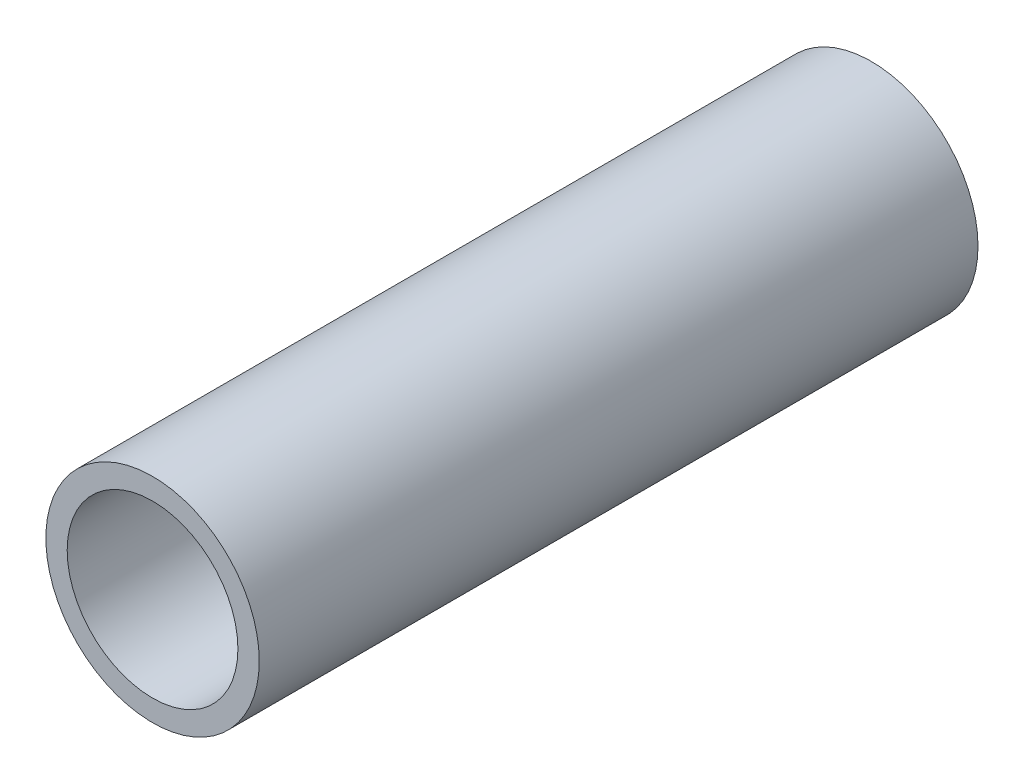
ISO-10303-21;
HEADER;
FILE_DESCRIPTION(('STEP AP214'),'2;1');
FILE_NAME('part.step','',(''),(''),'','','');
FILE_SCHEMA(('AUTOMOTIVE_DESIGN { 1 0 10303 214 1 1 1 1 }'));
ENDSEC;
DATA;
#1=APPLICATION_CONTEXT('core data for automotive mechanical design processes');
#2=APPLICATION_PROTOCOL_DEFINITION('international standard','automotive_design',2000,#1);
#3=PRODUCT_CONTEXT('',#1,'mechanical');
#4=PRODUCT('Part','Part','',(#3));
#5=PRODUCT_RELATED_PRODUCT_CATEGORY('part','',(#4));
#6=PRODUCT_DEFINITION_FORMATION('','',#4);
#7=PRODUCT_DEFINITION_CONTEXT('part definition',#1,'design');
#8=PRODUCT_DEFINITION('design','',#6,#7);
#9=PRODUCT_DEFINITION_SHAPE('','',#8);
#10=(LENGTH_UNIT() NAMED_UNIT(*) SI_UNIT(.MILLI.,.METRE.));
#11=(NAMED_UNIT(*) PLANE_ANGLE_UNIT() SI_UNIT($,.RADIAN.));
#12=(NAMED_UNIT(*) SI_UNIT($,.STERADIAN.) SOLID_ANGLE_UNIT());
#13=UNCERTAINTY_MEASURE_WITH_UNIT(LENGTH_MEASURE(1.E-05),#10,'distance_accuracy_value','');
#14=(GEOMETRIC_REPRESENTATION_CONTEXT(3) GLOBAL_UNCERTAINTY_ASSIGNED_CONTEXT((#13)) GLOBAL_UNIT_ASSIGNED_CONTEXT((#10,
#11,#12)) REPRESENTATION_CONTEXT('',''));
#15=CARTESIAN_POINT('',(0.,0.,0.));
#16=DIRECTION('',(0.,0.,1.));
#17=DIRECTION('',(1.,0.,0.));
#18=AXIS2_PLACEMENT_3D('',#15,#16,#17);
#19=CARTESIAN_POINT('',(0.,0.,8.42));
#20=DIRECTION('',(0.,0.,1.));
#21=DIRECTION('',(1.,0.,0.));
#22=AXIS2_PLACEMENT_3D('',#19,#20,#21);
#23=PLANE('',#22);
#24=CARTESIAN_POINT('',(0.,0.,8.42));
#25=DIRECTION('',(0.,0.,1.));
#26=DIRECTION('',(1.,0.,0.));
#27=AXIS2_PLACEMENT_3D('',#24,#25,#26);
#28=CIRCLE('',#27,1.25);
#29=CARTESIAN_POINT('',(1.25,0.,8.42));
#30=VERTEX_POINT('',#29);
#31=EDGE_CURVE('E10',#30,#30,#28,.T.);
#32=ORIENTED_EDGE('',*,*,#31,.T.);
#33=EDGE_LOOP('',(#32));
#34=FACE_BOUND('',#33,.T.);
#35=CARTESIAN_POINT('',(0.,0.,8.42));
#36=DIRECTION('',(0.,0.,1.));
#37=DIRECTION('',(1.,0.,0.));
#38=AXIS2_PLACEMENT_3D('',#35,#36,#37);
#39=CIRCLE('',#38,1.);
#40=CARTESIAN_POINT('',(1.,0.,8.42));
#41=VERTEX_POINT('',#40);
#42=EDGE_CURVE('E41',#41,#41,#39,.T.);
#43=ORIENTED_EDGE('',*,*,#42,.F.);
#44=EDGE_LOOP('',(#43));
#45=FACE_BOUND('',#44,.T.);
#46=ADVANCED_FACE('F30',(#34,#45),#23,.T.);
#47=CARTESIAN_POINT('',(0.,0.,0.));
#48=DIRECTION('',(0.,0.,1.));
#49=DIRECTION('',(1.,0.,0.));
#50=AXIS2_PLACEMENT_3D('',#47,#48,#49);
#51=PLANE('',#50);
#52=CARTESIAN_POINT('',(0.,0.,0.));
#53=DIRECTION('',(0.,0.,1.));
#54=DIRECTION('',(1.,0.,0.));
#55=AXIS2_PLACEMENT_3D('',#52,#53,#54);
#56=CIRCLE('',#55,1.25);
#57=CARTESIAN_POINT('',(1.25,0.,0.));
#58=VERTEX_POINT('',#57);
#59=EDGE_CURVE('E34',#58,#58,#56,.T.);
#60=ORIENTED_EDGE('',*,*,#59,.F.);
#61=EDGE_LOOP('',(#60));
#62=FACE_BOUND('',#61,.T.);
#63=CARTESIAN_POINT('',(0.,0.,0.));
#64=DIRECTION('',(0.,0.,1.));
#65=DIRECTION('',(1.,0.,0.));
#66=AXIS2_PLACEMENT_3D('',#63,#64,#65);
#67=CIRCLE('',#66,1.);
#68=CARTESIAN_POINT('',(1.,0.,0.));
#69=VERTEX_POINT('',#68);
#70=EDGE_CURVE('E43',#69,#69,#67,.T.);
#71=ORIENTED_EDGE('',*,*,#70,.T.);
#72=EDGE_LOOP('',(#71));
#73=FACE_BOUND('',#72,.T.);
#74=ADVANCED_FACE('F53',(#62,#73),#51,.F.);
#75=CARTESIAN_POINT('',(0.,0.,8.42));
#76=DIRECTION('',(0.,0.,-1.));
#77=DIRECTION('',(-1.,0.,0.));
#78=AXIS2_PLACEMENT_3D('',#75,#76,#77);
#79=CYLINDRICAL_SURFACE('',#78,1.25);
#80=ORIENTED_EDGE('',*,*,#31,.F.);
#81=EDGE_LOOP('',(#80));
#82=FACE_BOUND('',#81,.T.);
#83=ORIENTED_EDGE('',*,*,#59,.T.);
#84=EDGE_LOOP('',(#83));
#85=FACE_BOUND('',#84,.T.);
#86=ADVANCED_FACE('F32',(#82,#85),#79,.T.);
#87=CARTESIAN_POINT('',(0.,0.,8.42));
#88=DIRECTION('',(0.,0.,-1.));
#89=DIRECTION('',(-1.,0.,0.));
#90=AXIS2_PLACEMENT_3D('',#87,#88,#89);
#91=CYLINDRICAL_SURFACE('',#90,1.);
#92=ORIENTED_EDGE('',*,*,#42,.T.);
#93=EDGE_LOOP('',(#92));
#94=FACE_BOUND('',#93,.T.);
#95=ORIENTED_EDGE('',*,*,#70,.F.);
#96=EDGE_LOOP('',(#95));
#97=FACE_BOUND('',#96,.T.);
#98=ADVANCED_FACE('F49',(#94,#97),#91,.F.);
#99=CLOSED_SHELL('',(#46,#74,#86,#98));
#100=MANIFOLD_SOLID_BREP('B2',#99);
#101=ADVANCED_BREP_SHAPE_REPRESENTATION('',(#18,#100),#14);
#102=SHAPE_DEFINITION_REPRESENTATION(#9,#101);
ENDSEC;
END-ISO-10303-21;
